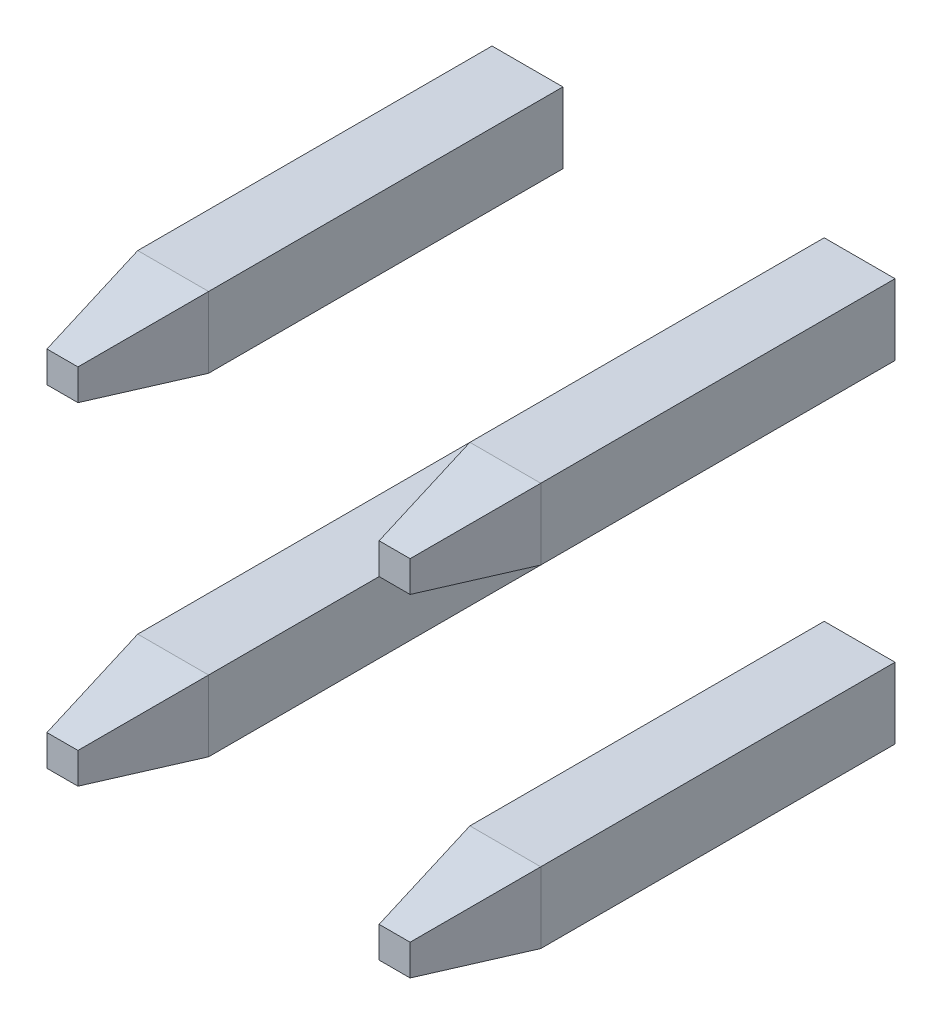
ISO-10303-21;
HEADER;
FILE_DESCRIPTION(('STEP AP214'),'2;1');
FILE_NAME('part.step','',(''),(''),'','','');
FILE_SCHEMA(('AUTOMOTIVE_DESIGN { 1 0 10303 214 1 1 1 1 }'));
ENDSEC;
DATA;
#1=APPLICATION_CONTEXT('core data for automotive mechanical design processes');
#2=APPLICATION_PROTOCOL_DEFINITION('international standard','automotive_design',2000,#1);
#3=PRODUCT_CONTEXT('',#1,'mechanical');
#4=PRODUCT('Part','Part','',(#3));
#5=PRODUCT_RELATED_PRODUCT_CATEGORY('part','',(#4));
#6=PRODUCT_DEFINITION_FORMATION('','',#4);
#7=PRODUCT_DEFINITION_CONTEXT('part definition',#1,'design');
#8=PRODUCT_DEFINITION('design','',#6,#7);
#9=PRODUCT_DEFINITION_SHAPE('','',#8);
#10=(LENGTH_UNIT() NAMED_UNIT(*) SI_UNIT(.MILLI.,.METRE.));
#11=(NAMED_UNIT(*) PLANE_ANGLE_UNIT() SI_UNIT($,.RADIAN.));
#12=(NAMED_UNIT(*) SI_UNIT($,.STERADIAN.) SOLID_ANGLE_UNIT());
#13=UNCERTAINTY_MEASURE_WITH_UNIT(LENGTH_MEASURE(1.E-05),#10,'distance_accuracy_value','');
#14=(GEOMETRIC_REPRESENTATION_CONTEXT(3) GLOBAL_UNCERTAINTY_ASSIGNED_CONTEXT((#13)) GLOBAL_UNIT_ASSIGNED_CONTEXT((#10,
#11,#12)) REPRESENTATION_CONTEXT('',''));
#15=CARTESIAN_POINT('',(0.,0.,0.));
#16=DIRECTION('',(0.,0.,1.));
#17=DIRECTION('',(1.,0.,0.));
#18=AXIS2_PLACEMENT_3D('',#15,#16,#17);
#19=CARTESIAN_POINT('',(-1.27,1.5,2.055));
#20=DIRECTION('',(0.984183323973751,0.,0.177152998314955));
#21=DIRECTION('',(0.,-1.,0.));
#22=AXIS2_PLACEMENT_3D('',#19,#20,#21);
#23=PLANE('',#22);
#24=DIRECTION('',(0.,-1.,0.));
#25=VECTOR('',#24,1.);
#26=CARTESIAN_POINT('',(-1.36,1.64,2.555));
#27=LINE('',#26,#25);
#28=CARTESIAN_POINT('',(-1.36,1.64,2.555));
#29=VERTEX_POINT('',#28);
#30=CARTESIAN_POINT('',(-1.36,1.36,2.555));
#31=VERTEX_POINT('',#30);
#32=EDGE_CURVE('P0_E65',#29,#31,#27,.T.);
#33=ORIENTED_EDGE('',*,*,#32,.T.);
#34=DIRECTION('',(-0.174436949744993,0.174436949744993,0.969094165252957));
#35=VECTOR('',#34,1.);
#36=CARTESIAN_POINT('',(-1.18,1.18,1.555));
#37=LINE('',#36,#35);
#38=CARTESIAN_POINT('',(-1.18,1.18,1.555));
#39=VERTEX_POINT('',#38);
#40=EDGE_CURVE('P0_E68',#39,#31,#37,.T.);
#41=ORIENTED_EDGE('',*,*,#40,.F.);
#42=DIRECTION('',(0.,-1.,0.));
#43=VECTOR('',#42,1.);
#44=CARTESIAN_POINT('',(-1.18,1.82,1.555));
#45=LINE('',#44,#43);
#46=CARTESIAN_POINT('',(-1.18,1.82,1.555));
#47=VERTEX_POINT('',#46);
#48=EDGE_CURVE('P0_E141',#47,#39,#45,.T.);
#49=ORIENTED_EDGE('',*,*,#48,.F.);
#50=DIRECTION('',(0.174436949744993,0.174436949744993,-0.969094165252957));
#51=VECTOR('',#50,1.);
#52=CARTESIAN_POINT('',(-1.36,1.64,2.555));
#53=LINE('',#52,#51);
#54=EDGE_CURVE('P0_E11',#29,#47,#53,.T.);
#55=ORIENTED_EDGE('',*,*,#54,.F.);
#56=EDGE_LOOP('',(#33,#41,#49,#55));
#57=FACE_BOUND('',#56,.T.);
#58=ADVANCED_FACE('P0_F17',(#57),#23,.T.);
#59=CARTESIAN_POINT('',(-1.5,1.73,2.055));
#60=DIRECTION('',(0.,0.984183323973751,0.177152998314955));
#61=DIRECTION('',(1.,0.,0.));
#62=AXIS2_PLACEMENT_3D('',#59,#60,#61);
#63=PLANE('',#62);
#64=DIRECTION('',(-1.,0.,0.));
#65=VECTOR('',#64,1.);
#66=CARTESIAN_POINT('',(-1.18,1.82,1.555));
#67=LINE('',#66,#65);
#68=CARTESIAN_POINT('',(-1.82,1.82,1.555));
#69=VERTEX_POINT('',#68);
#70=EDGE_CURVE('P0_E114',#47,#69,#67,.T.);
#71=ORIENTED_EDGE('',*,*,#70,.T.);
#72=DIRECTION('',(-0.174436949744993,0.174436949744993,-0.969094165252957));
#73=VECTOR('',#72,1.);
#74=CARTESIAN_POINT('',(-1.64,1.64,2.555));
#75=LINE('',#74,#73);
#76=CARTESIAN_POINT('',(-1.64,1.64,2.555));
#77=VERTEX_POINT('',#76);
#78=EDGE_CURVE('P0_E27',#77,#69,#75,.T.);
#79=ORIENTED_EDGE('',*,*,#78,.F.);
#80=DIRECTION('',(-1.,0.,0.));
#81=VECTOR('',#80,1.);
#82=CARTESIAN_POINT('',(-1.36,1.64,2.555));
#83=LINE('',#82,#81);
#84=EDGE_CURVE('P0_E74',#29,#77,#83,.T.);
#85=ORIENTED_EDGE('',*,*,#84,.F.);
#86=ORIENTED_EDGE('',*,*,#54,.T.);
#87=EDGE_LOOP('',(#71,#79,#85,#86));
#88=FACE_BOUND('',#87,.T.);
#89=ADVANCED_FACE('P0_F187',(#88),#63,.T.);
#90=CARTESIAN_POINT('',(-1.73,1.5,2.055));
#91=DIRECTION('',(-0.984183323973751,0.,0.177152998314955));
#92=DIRECTION('',(0.,1.,0.));
#93=AXIS2_PLACEMENT_3D('',#90,#91,#92);
#94=PLANE('',#93);
#95=DIRECTION('',(0.,1.,0.));
#96=VECTOR('',#95,1.);
#97=CARTESIAN_POINT('',(-1.82,1.18,1.555));
#98=LINE('',#97,#96);
#99=CARTESIAN_POINT('',(-1.82,1.18,1.555));
#100=VERTEX_POINT('',#99);
#101=EDGE_CURVE('P0_E99',#100,#69,#98,.T.);
#102=ORIENTED_EDGE('',*,*,#101,.F.);
#103=DIRECTION('',(-0.174436949744993,-0.174436949744993,-0.969094165252957));
#104=VECTOR('',#103,1.);
#105=CARTESIAN_POINT('',(-1.64,1.36,2.555));
#106=LINE('',#105,#104);
#107=CARTESIAN_POINT('',(-1.64,1.36,2.555));
#108=VERTEX_POINT('',#107);
#109=EDGE_CURVE('P0_E84',#108,#100,#106,.T.);
#110=ORIENTED_EDGE('',*,*,#109,.F.);
#111=DIRECTION('',(0.,1.,0.));
#112=VECTOR('',#111,1.);
#113=CARTESIAN_POINT('',(-1.64,1.36,2.555));
#114=LINE('',#113,#112);
#115=EDGE_CURVE('P0_E86',#108,#77,#114,.T.);
#116=ORIENTED_EDGE('',*,*,#115,.T.);
#117=ORIENTED_EDGE('',*,*,#78,.T.);
#118=EDGE_LOOP('',(#102,#110,#116,#117));
#119=FACE_BOUND('',#118,.T.);
#120=ADVANCED_FACE('P0_F192',(#119),#94,.T.);
#121=CARTESIAN_POINT('',(-1.18,1.82,2.555));
#122=DIRECTION('',(0.,0.,1.));
#123=DIRECTION('',(1.,0.,0.));
#124=AXIS2_PLACEMENT_3D('',#121,#122,#123);
#125=PLANE('',#124);
#126=DIRECTION('',(-1.,0.,0.));
#127=VECTOR('',#126,1.);
#128=CARTESIAN_POINT('',(-1.36,1.36,2.555));
#129=LINE('',#128,#127);
#130=EDGE_CURVE('P0_E79',#31,#108,#129,.T.);
#131=ORIENTED_EDGE('',*,*,#130,.F.);
#132=ORIENTED_EDGE('',*,*,#32,.F.);
#133=ORIENTED_EDGE('',*,*,#84,.T.);
#134=ORIENTED_EDGE('',*,*,#115,.F.);
#135=EDGE_LOOP('',(#131,#132,#133,#134));
#136=FACE_BOUND('',#135,.T.);
#137=ADVANCED_FACE('P0_F19',(#136),#125,.T.);
#138=CARTESIAN_POINT('',(-1.5,1.27,2.055));
#139=DIRECTION('',(0.,-0.984183323973751,0.177152998314955));
#140=DIRECTION('',(-1.,0.,0.));
#141=AXIS2_PLACEMENT_3D('',#138,#139,#140);
#142=PLANE('',#141);
#143=ORIENTED_EDGE('',*,*,#130,.T.);
#144=ORIENTED_EDGE('',*,*,#109,.T.);
#145=DIRECTION('',(-1.,0.,0.));
#146=VECTOR('',#145,1.);
#147=CARTESIAN_POINT('',(-1.18,1.18,1.555));
#148=LINE('',#147,#146);
#149=EDGE_CURVE('P0_E81',#39,#100,#148,.T.);
#150=ORIENTED_EDGE('',*,*,#149,.F.);
#151=ORIENTED_EDGE('',*,*,#40,.T.);
#152=EDGE_LOOP('',(#143,#144,#150,#151));
#153=FACE_BOUND('',#152,.T.);
#154=ADVANCED_FACE('P0_F78',(#153),#142,.T.);
#155=CARTESIAN_POINT('',(-1.18,1.18,2.555));
#156=DIRECTION('',(0.,-1.,0.));
#157=DIRECTION('',(0.,0.,-1.));
#158=AXIS2_PLACEMENT_3D('',#155,#156,#157);
#159=PLANE('',#158);
#160=ORIENTED_EDGE('',*,*,#149,.T.);
#161=DIRECTION('',(0.,0.,-1.));
#162=VECTOR('',#161,1.);
#163=CARTESIAN_POINT('',(-1.82,1.18,1.555));
#164=LINE('',#163,#162);
#165=CARTESIAN_POINT('',(-1.82,1.18,-1.645));
#166=VERTEX_POINT('',#165);
#167=EDGE_CURVE('P0_E96',#100,#166,#164,.T.);
#168=ORIENTED_EDGE('',*,*,#167,.T.);
#169=DIRECTION('',(1.,0.,0.));
#170=VECTOR('',#169,1.);
#171=CARTESIAN_POINT('',(-1.82,1.18,-1.645));
#172=LINE('',#171,#170);
#173=CARTESIAN_POINT('',(-1.18,1.18,-1.645));
#174=VERTEX_POINT('',#173);
#175=EDGE_CURVE('P0_E157',#166,#174,#172,.T.);
#176=ORIENTED_EDGE('',*,*,#175,.T.);
#177=DIRECTION('',(0.,0.,-1.));
#178=VECTOR('',#177,1.);
#179=CARTESIAN_POINT('',(-1.18,1.18,1.555));
#180=LINE('',#179,#178);
#181=EDGE_CURVE('P0_E131',#39,#174,#180,.T.);
#182=ORIENTED_EDGE('',*,*,#181,.F.);
#183=EDGE_LOOP('',(#160,#168,#176,#182));
#184=FACE_BOUND('',#183,.T.);
#185=ADVANCED_FACE('P0_F193',(#184),#159,.T.);
#186=CARTESIAN_POINT('',(-1.82,0.,0.));
#187=DIRECTION('',(1.,0.,0.));
#188=DIRECTION('',(0.,1.,0.));
#189=AXIS2_PLACEMENT_3D('',#186,#187,#188);
#190=PLANE('',#189);
#191=ORIENTED_EDGE('',*,*,#101,.T.);
#192=DIRECTION('',(0.,0.,1.));
#193=VECTOR('',#192,1.);
#194=CARTESIAN_POINT('',(-1.82,1.82,-1.645));
#195=LINE('',#194,#193);
#196=CARTESIAN_POINT('',(-1.82,1.82,-1.645));
#197=VERTEX_POINT('',#196);
#198=EDGE_CURVE('P0_E115',#197,#69,#195,.T.);
#199=ORIENTED_EDGE('',*,*,#198,.F.);
#200=DIRECTION('',(0.,1.,0.));
#201=VECTOR('',#200,1.);
#202=CARTESIAN_POINT('',(-1.82,1.18,-1.645));
#203=LINE('',#202,#201);
#204=EDGE_CURVE('P0_E150',#166,#197,#203,.T.);
#205=ORIENTED_EDGE('',*,*,#204,.F.);
#206=ORIENTED_EDGE('',*,*,#167,.F.);
#207=EDGE_LOOP('',(#191,#199,#205,#206));
#208=FACE_BOUND('',#207,.T.);
#209=ADVANCED_FACE('P0_F190',(#208),#190,.F.);
#210=CARTESIAN_POINT('',(-1.18,1.82,-6.905));
#211=DIRECTION('',(0.,1.,0.));
#212=DIRECTION('',(1.,0.,0.));
#213=AXIS2_PLACEMENT_3D('',#210,#211,#212);
#214=PLANE('',#213);
#215=ORIENTED_EDGE('',*,*,#70,.F.);
#216=DIRECTION('',(0.,0.,1.));
#217=VECTOR('',#216,1.);
#218=CARTESIAN_POINT('',(-1.18,1.82,-1.645));
#219=LINE('',#218,#217);
#220=CARTESIAN_POINT('',(-1.18,1.82,-1.645));
#221=VERTEX_POINT('',#220);
#222=EDGE_CURVE('P0_E126',#221,#47,#219,.T.);
#223=ORIENTED_EDGE('',*,*,#222,.F.);
#224=DIRECTION('',(1.,0.,0.));
#225=VECTOR('',#224,1.);
#226=CARTESIAN_POINT('',(-1.82,1.82,-1.645));
#227=LINE('',#226,#225);
#228=EDGE_CURVE('P0_E145',#197,#221,#227,.T.);
#229=ORIENTED_EDGE('',*,*,#228,.F.);
#230=ORIENTED_EDGE('',*,*,#198,.T.);
#231=EDGE_LOOP('',(#215,#223,#229,#230));
#232=FACE_BOUND('',#231,.T.);
#233=ADVANCED_FACE('P0_F188',(#232),#214,.T.);
#234=CARTESIAN_POINT('',(-1.18,0.,0.));
#235=DIRECTION('',(1.,0.,0.));
#236=DIRECTION('',(0.,1.,0.));
#237=AXIS2_PLACEMENT_3D('',#234,#235,#236);
#238=PLANE('',#237);
#239=ORIENTED_EDGE('',*,*,#48,.T.);
#240=ORIENTED_EDGE('',*,*,#181,.T.);
#241=DIRECTION('',(0.,1.,0.));
#242=VECTOR('',#241,1.);
#243=CARTESIAN_POINT('',(-1.18,1.18,-1.645));
#244=LINE('',#243,#242);
#245=EDGE_CURVE('P0_E161',#174,#221,#244,.T.);
#246=ORIENTED_EDGE('',*,*,#245,.T.);
#247=ORIENTED_EDGE('',*,*,#222,.T.);
#248=EDGE_LOOP('',(#239,#240,#246,#247));
#249=FACE_BOUND('',#248,.T.);
#250=ADVANCED_FACE('P0_F167',(#249),#238,.T.);
#251=CARTESIAN_POINT('',(-1.619335750828,1.563108766945,-1.645));
#252=DIRECTION('',(0.,0.,1.));
#253=DIRECTION('',(1.,0.,0.));
#254=AXIS2_PLACEMENT_3D('',#251,#252,#253);
#255=PLANE('',#254);
#256=ORIENTED_EDGE('',*,*,#245,.F.);
#257=ORIENTED_EDGE('',*,*,#175,.F.);
#258=ORIENTED_EDGE('',*,*,#204,.T.);
#259=ORIENTED_EDGE('',*,*,#228,.T.);
#260=EDGE_LOOP('',(#256,#257,#258,#259));
#261=FACE_BOUND('',#260,.T.);
#262=ADVANCED_FACE('P0_F174',(#261),#255,.F.);
#263=CLOSED_SHELL('',(#58,#89,#120,#137,#154,#185,#209,#233,#250,#262));
#264=MANIFOLD_SOLID_BREP('P0_B1',#263);
#265=CARTESIAN_POINT('',(1.428164169133,1.473145672445,-1.645));
#266=DIRECTION('',(0.,0.,1.));
#267=DIRECTION('',(1.,0.,0.));
#268=AXIS2_PLACEMENT_3D('',#265,#266,#267);
#269=PLANE('',#268);
#270=DIRECTION('',(0.,1.,0.));
#271=VECTOR('',#270,1.);
#272=CARTESIAN_POINT('',(1.82,1.18,-1.645));
#273=LINE('',#272,#271);
#274=CARTESIAN_POINT('',(1.82,1.18,-1.645));
#275=VERTEX_POINT('',#274);
#276=CARTESIAN_POINT('',(1.82,1.82,-1.645));
#277=VERTEX_POINT('',#276);
#278=EDGE_CURVE('P1_E11',#275,#277,#273,.T.);
#279=ORIENTED_EDGE('',*,*,#278,.F.);
#280=DIRECTION('',(1.,0.,0.));
#281=VECTOR('',#280,1.);
#282=CARTESIAN_POINT('',(1.18,1.18,-1.645));
#283=LINE('',#282,#281);
#284=CARTESIAN_POINT('',(1.18,1.18,-1.645));
#285=VERTEX_POINT('',#284);
#286=EDGE_CURVE('P1_E71',#285,#275,#283,.T.);
#287=ORIENTED_EDGE('',*,*,#286,.F.);
#288=DIRECTION('',(0.,1.,0.));
#289=VECTOR('',#288,1.);
#290=CARTESIAN_POINT('',(1.18,1.18,-1.645));
#291=LINE('',#290,#289);
#292=CARTESIAN_POINT('',(1.18,1.82,-1.645));
#293=VERTEX_POINT('',#292);
#294=EDGE_CURVE('P1_E74',#285,#293,#291,.T.);
#295=ORIENTED_EDGE('',*,*,#294,.T.);
#296=DIRECTION('',(1.,0.,0.));
#297=VECTOR('',#296,1.);
#298=CARTESIAN_POINT('',(1.18,1.82,-1.645));
#299=LINE('',#298,#297);
#300=EDGE_CURVE('P1_E27',#293,#277,#299,.T.);
#301=ORIENTED_EDGE('',*,*,#300,.T.);
#302=EDGE_LOOP('',(#279,#287,#295,#301));
#303=FACE_BOUND('',#302,.T.);
#304=ADVANCED_FACE('P1_F17',(#303),#269,.F.);
#305=CARTESIAN_POINT('',(1.82,0.,0.));
#306=DIRECTION('',(1.,0.,0.));
#307=DIRECTION('',(0.,1.,0.));
#308=AXIS2_PLACEMENT_3D('',#305,#306,#307);
#309=PLANE('',#308);
#310=DIRECTION('',(0.,-1.,0.));
#311=VECTOR('',#310,1.);
#312=CARTESIAN_POINT('',(1.82,1.82,1.555));
#313=LINE('',#312,#311);
#314=CARTESIAN_POINT('',(1.82,1.82,1.555));
#315=VERTEX_POINT('',#314);
#316=CARTESIAN_POINT('',(1.82,1.18,1.555));
#317=VERTEX_POINT('',#316);
#318=EDGE_CURVE('P1_E110',#315,#317,#313,.T.);
#319=ORIENTED_EDGE('',*,*,#318,.T.);
#320=DIRECTION('',(0.,0.,-1.));
#321=VECTOR('',#320,1.);
#322=CARTESIAN_POINT('',(1.82,1.18,1.555));
#323=LINE('',#322,#321);
#324=EDGE_CURVE('P1_E78',#317,#275,#323,.T.);
#325=ORIENTED_EDGE('',*,*,#324,.T.);
#326=ORIENTED_EDGE('',*,*,#278,.T.);
#327=DIRECTION('',(0.,0.,1.));
#328=VECTOR('',#327,1.);
#329=CARTESIAN_POINT('',(1.82,1.82,-1.645));
#330=LINE('',#329,#328);
#331=EDGE_CURVE('P1_E20',#277,#315,#330,.T.);
#332=ORIENTED_EDGE('',*,*,#331,.T.);
#333=EDGE_LOOP('',(#319,#325,#326,#332));
#334=FACE_BOUND('',#333,.T.);
#335=ADVANCED_FACE('P1_F172',(#334),#309,.T.);
#336=CARTESIAN_POINT('',(1.82,1.82,-6.905));
#337=DIRECTION('',(0.,1.,0.));
#338=DIRECTION('',(1.,0.,0.));
#339=AXIS2_PLACEMENT_3D('',#336,#337,#338);
#340=PLANE('',#339);
#341=DIRECTION('',(-1.,0.,0.));
#342=VECTOR('',#341,1.);
#343=CARTESIAN_POINT('',(1.82,1.82,1.555));
#344=LINE('',#343,#342);
#345=CARTESIAN_POINT('',(1.18,1.82,1.555));
#346=VERTEX_POINT('',#345);
#347=EDGE_CURVE('P1_E109',#315,#346,#344,.T.);
#348=ORIENTED_EDGE('',*,*,#347,.F.);
#349=ORIENTED_EDGE('',*,*,#331,.F.);
#350=ORIENTED_EDGE('',*,*,#300,.F.);
#351=DIRECTION('',(0.,0.,1.));
#352=VECTOR('',#351,1.);
#353=CARTESIAN_POINT('',(1.18,1.82,-1.645));
#354=LINE('',#353,#352);
#355=EDGE_CURVE('P1_E93',#293,#346,#354,.T.);
#356=ORIENTED_EDGE('',*,*,#355,.T.);
#357=EDGE_LOOP('',(#348,#349,#350,#356));
#358=FACE_BOUND('',#357,.T.);
#359=ADVANCED_FACE('P1_F176',(#358),#340,.T.);
#360=CARTESIAN_POINT('',(1.82,1.18,2.555));
#361=DIRECTION('',(0.,-1.,0.));
#362=DIRECTION('',(0.,0.,-1.));
#363=AXIS2_PLACEMENT_3D('',#360,#361,#362);
#364=PLANE('',#363);
#365=DIRECTION('',(-1.,0.,0.));
#366=VECTOR('',#365,1.);
#367=CARTESIAN_POINT('',(1.82,1.18,1.555));
#368=LINE('',#367,#366);
#369=CARTESIAN_POINT('',(1.18,1.18,1.555));
#370=VERTEX_POINT('',#369);
#371=EDGE_CURVE('P1_E84',#317,#370,#368,.T.);
#372=ORIENTED_EDGE('',*,*,#371,.T.);
#373=DIRECTION('',(0.,0.,-1.));
#374=VECTOR('',#373,1.);
#375=CARTESIAN_POINT('',(1.18,1.18,1.555));
#376=LINE('',#375,#374);
#377=EDGE_CURVE('P1_E79',#370,#285,#376,.T.);
#378=ORIENTED_EDGE('',*,*,#377,.T.);
#379=ORIENTED_EDGE('',*,*,#286,.T.);
#380=ORIENTED_EDGE('',*,*,#324,.F.);
#381=EDGE_LOOP('',(#372,#378,#379,#380));
#382=FACE_BOUND('',#381,.T.);
#383=ADVANCED_FACE('P1_F82',(#382),#364,.T.);
#384=CARTESIAN_POINT('',(1.18,0.,0.));
#385=DIRECTION('',(1.,0.,0.));
#386=DIRECTION('',(0.,1.,0.));
#387=AXIS2_PLACEMENT_3D('',#384,#385,#386);
#388=PLANE('',#387);
#389=DIRECTION('',(0.,1.,0.));
#390=VECTOR('',#389,1.);
#391=CARTESIAN_POINT('',(1.18,1.18,1.555));
#392=LINE('',#391,#390);
#393=EDGE_CURVE('P1_E100',#370,#346,#392,.T.);
#394=ORIENTED_EDGE('',*,*,#393,.T.);
#395=ORIENTED_EDGE('',*,*,#355,.F.);
#396=ORIENTED_EDGE('',*,*,#294,.F.);
#397=ORIENTED_EDGE('',*,*,#377,.F.);
#398=EDGE_LOOP('',(#394,#395,#396,#397));
#399=FACE_BOUND('',#398,.T.);
#400=ADVANCED_FACE('P1_F91',(#399),#388,.F.);
#401=CARTESIAN_POINT('',(1.27,1.5,2.055));
#402=DIRECTION('',(-0.984183323973751,0.,0.177152998314955));
#403=DIRECTION('',(0.,1.,0.));
#404=AXIS2_PLACEMENT_3D('',#401,#402,#403);
#405=PLANE('',#404);
#406=ORIENTED_EDGE('',*,*,#393,.F.);
#407=DIRECTION('',(-0.174436949744993,-0.174436949744993,-0.969094165252957));
#408=VECTOR('',#407,1.);
#409=CARTESIAN_POINT('',(1.36,1.36,2.555));
#410=LINE('',#409,#408);
#411=CARTESIAN_POINT('',(1.36,1.36,2.555));
#412=VERTEX_POINT('',#411);
#413=EDGE_CURVE('P1_E135',#412,#370,#410,.T.);
#414=ORIENTED_EDGE('',*,*,#413,.F.);
#415=DIRECTION('',(0.,1.,0.));
#416=VECTOR('',#415,1.);
#417=CARTESIAN_POINT('',(1.36,1.36,2.555));
#418=LINE('',#417,#416);
#419=CARTESIAN_POINT('',(1.36,1.64,2.555));
#420=VERTEX_POINT('',#419);
#421=EDGE_CURVE('P1_E111',#412,#420,#418,.T.);
#422=ORIENTED_EDGE('',*,*,#421,.T.);
#423=DIRECTION('',(-0.174436949744993,0.174436949744993,-0.969094165252957));
#424=VECTOR('',#423,1.);
#425=CARTESIAN_POINT('',(1.36,1.64,2.555));
#426=LINE('',#425,#424);
#427=EDGE_CURVE('P1_E127',#420,#346,#426,.T.);
#428=ORIENTED_EDGE('',*,*,#427,.T.);
#429=EDGE_LOOP('',(#406,#414,#422,#428));
#430=FACE_BOUND('',#429,.T.);
#431=ADVANCED_FACE('P1_F189',(#430),#405,.T.);
#432=CARTESIAN_POINT('',(1.5,1.73,2.055));
#433=DIRECTION('',(0.,0.984183323973751,0.177152998314955));
#434=DIRECTION('',(1.,0.,0.));
#435=AXIS2_PLACEMENT_3D('',#432,#433,#434);
#436=PLANE('',#435);
#437=ORIENTED_EDGE('',*,*,#347,.T.);
#438=ORIENTED_EDGE('',*,*,#427,.F.);
#439=DIRECTION('',(-1.,0.,0.));
#440=VECTOR('',#439,1.);
#441=CARTESIAN_POINT('',(1.64,1.64,2.555));
#442=LINE('',#441,#440);
#443=CARTESIAN_POINT('',(1.64,1.64,2.555));
#444=VERTEX_POINT('',#443);
#445=EDGE_CURVE('P1_E115',#444,#420,#442,.T.);
#446=ORIENTED_EDGE('',*,*,#445,.F.);
#447=DIRECTION('',(0.174436949744993,0.174436949744993,-0.969094165252957));
#448=VECTOR('',#447,1.);
#449=CARTESIAN_POINT('',(1.64,1.64,2.555));
#450=LINE('',#449,#448);
#451=EDGE_CURVE('P1_E105',#444,#315,#450,.T.);
#452=ORIENTED_EDGE('',*,*,#451,.T.);
#453=EDGE_LOOP('',(#437,#438,#446,#452));
#454=FACE_BOUND('',#453,.T.);
#455=ADVANCED_FACE('P1_F179',(#454),#436,.T.);
#456=CARTESIAN_POINT('',(1.73,1.5,2.055));
#457=DIRECTION('',(0.984183323973751,0.,0.177152998314955));
#458=DIRECTION('',(0.,-1.,0.));
#459=AXIS2_PLACEMENT_3D('',#456,#457,#458);
#460=PLANE('',#459);
#461=DIRECTION('',(0.,-1.,0.));
#462=VECTOR('',#461,1.);
#463=CARTESIAN_POINT('',(1.64,1.64,2.555));
#464=LINE('',#463,#462);
#465=CARTESIAN_POINT('',(1.64,1.36,2.555));
#466=VERTEX_POINT('',#465);
#467=EDGE_CURVE('P1_E116',#444,#466,#464,.T.);
#468=ORIENTED_EDGE('',*,*,#467,.T.);
#469=DIRECTION('',(-0.174436949744993,0.174436949744993,0.969094165252957));
#470=VECTOR('',#469,1.);
#471=CARTESIAN_POINT('',(1.82,1.18,1.555));
#472=LINE('',#471,#470);
#473=EDGE_CURVE('P1_E120',#317,#466,#472,.T.);
#474=ORIENTED_EDGE('',*,*,#473,.F.);
#475=ORIENTED_EDGE('',*,*,#318,.F.);
#476=ORIENTED_EDGE('',*,*,#451,.F.);
#477=EDGE_LOOP('',(#468,#474,#475,#476));
#478=FACE_BOUND('',#477,.T.);
#479=ADVANCED_FACE('P1_F180',(#478),#460,.T.);
#480=CARTESIAN_POINT('',(1.82,1.82,2.555));
#481=DIRECTION('',(0.,0.,1.));
#482=DIRECTION('',(1.,0.,0.));
#483=AXIS2_PLACEMENT_3D('',#480,#481,#482);
#484=PLANE('',#483);
#485=DIRECTION('',(-1.,0.,0.));
#486=VECTOR('',#485,1.);
#487=CARTESIAN_POINT('',(1.64,1.36,2.555));
#488=LINE('',#487,#486);
#489=EDGE_CURVE('P1_E144',#466,#412,#488,.T.);
#490=ORIENTED_EDGE('',*,*,#489,.F.);
#491=ORIENTED_EDGE('',*,*,#467,.F.);
#492=ORIENTED_EDGE('',*,*,#445,.T.);
#493=ORIENTED_EDGE('',*,*,#421,.F.);
#494=EDGE_LOOP('',(#490,#491,#492,#493));
#495=FACE_BOUND('',#494,.T.);
#496=ADVANCED_FACE('P1_F160',(#495),#484,.T.);
#497=CARTESIAN_POINT('',(1.5,1.27,2.055));
#498=DIRECTION('',(0.,-0.984183323973751,0.177152998314955));
#499=DIRECTION('',(-1.,0.,0.));
#500=AXIS2_PLACEMENT_3D('',#497,#498,#499);
#501=PLANE('',#500);
#502=ORIENTED_EDGE('',*,*,#489,.T.);
#503=ORIENTED_EDGE('',*,*,#413,.T.);
#504=ORIENTED_EDGE('',*,*,#371,.F.);
#505=ORIENTED_EDGE('',*,*,#473,.T.);
#506=EDGE_LOOP('',(#502,#503,#504,#505));
#507=FACE_BOUND('',#506,.T.);
#508=ADVANCED_FACE('P1_F153',(#507),#501,.T.);
#509=CLOSED_SHELL('',(#304,#335,#359,#383,#400,#431,#455,#479,#496,#508));
#510=MANIFOLD_SOLID_BREP('P1_B1',#509);
#511=CARTESIAN_POINT('',(-1.18,-1.82,2.555));
#512=DIRECTION('',(0.,-1.,0.));
#513=DIRECTION('',(0.,0.,-1.));
#514=AXIS2_PLACEMENT_3D('',#511,#512,#513);
#515=PLANE('',#514);
#516=DIRECTION('',(-1.,0.,0.));
#517=VECTOR('',#516,1.);
#518=CARTESIAN_POINT('',(-1.18,-1.82,1.555));
#519=LINE('',#518,#517);
#520=CARTESIAN_POINT('',(-1.18,-1.82,1.555));
#521=VERTEX_POINT('',#520);
#522=CARTESIAN_POINT('',(-1.82,-1.82,1.555));
#523=VERTEX_POINT('',#522);
#524=EDGE_CURVE('P2_E11',#521,#523,#519,.T.);
#525=ORIENTED_EDGE('',*,*,#524,.T.);
#526=DIRECTION('',(0.,0.,-1.));
#527=VECTOR('',#526,1.);
#528=CARTESIAN_POINT('',(-1.82,-1.82,1.555));
#529=LINE('',#528,#527);
#530=CARTESIAN_POINT('',(-1.82,-1.82,-1.645));
#531=VERTEX_POINT('',#530);
#532=EDGE_CURVE('P2_E113',#523,#531,#529,.T.);
#533=ORIENTED_EDGE('',*,*,#532,.T.);
#534=DIRECTION('',(1.,0.,0.));
#535=VECTOR('',#534,1.);
#536=CARTESIAN_POINT('',(-1.82,-1.82,-1.645));
#537=LINE('',#536,#535);
#538=CARTESIAN_POINT('',(-1.18,-1.82,-1.645));
#539=VERTEX_POINT('',#538);
#540=EDGE_CURVE('P2_E111',#531,#539,#537,.T.);
#541=ORIENTED_EDGE('',*,*,#540,.T.);
#542=DIRECTION('',(0.,0.,-1.));
#543=VECTOR('',#542,1.);
#544=CARTESIAN_POINT('',(-1.18,-1.82,1.555));
#545=LINE('',#544,#543);
#546=EDGE_CURVE('P2_E98',#521,#539,#545,.T.);
#547=ORIENTED_EDGE('',*,*,#546,.F.);
#548=EDGE_LOOP('',(#525,#533,#541,#547));
#549=FACE_BOUND('',#548,.T.);
#550=ADVANCED_FACE('P2_F17',(#549),#515,.T.);
#551=CARTESIAN_POINT('',(-1.5,-1.73,2.055));
#552=DIRECTION('',(0.,-0.984183323973751,0.177152998314955));
#553=DIRECTION('',(-1.,0.,0.));
#554=AXIS2_PLACEMENT_3D('',#551,#552,#553);
#555=PLANE('',#554);
#556=DIRECTION('',(-1.,0.,0.));
#557=VECTOR('',#556,1.);
#558=CARTESIAN_POINT('',(-1.36,-1.64,2.555));
#559=LINE('',#558,#557);
#560=CARTESIAN_POINT('',(-1.36,-1.64,2.555));
#561=VERTEX_POINT('',#560);
#562=CARTESIAN_POINT('',(-1.64,-1.64,2.555));
#563=VERTEX_POINT('',#562);
#564=EDGE_CURVE('P2_E25',#561,#563,#559,.T.);
#565=ORIENTED_EDGE('',*,*,#564,.T.);
#566=DIRECTION('',(-0.174436949744993,-0.174436949744993,-0.969094165252957));
#567=VECTOR('',#566,1.);
#568=CARTESIAN_POINT('',(-1.64,-1.64,2.555));
#569=LINE('',#568,#567);
#570=EDGE_CURVE('P2_E148',#563,#523,#569,.T.);
#571=ORIENTED_EDGE('',*,*,#570,.T.);
#572=ORIENTED_EDGE('',*,*,#524,.F.);
#573=DIRECTION('',(-0.174436949744993,0.174436949744993,0.969094165252957));
#574=VECTOR('',#573,1.);
#575=CARTESIAN_POINT('',(-1.18,-1.82,1.555));
#576=LINE('',#575,#574);
#577=EDGE_CURVE('P2_E164',#521,#561,#576,.T.);
#578=ORIENTED_EDGE('',*,*,#577,.T.);
#579=EDGE_LOOP('',(#565,#571,#572,#578));
#580=FACE_BOUND('',#579,.T.);
#581=ADVANCED_FACE('P2_F239',(#580),#555,.T.);
#582=CARTESIAN_POINT('',(-1.18,-1.18,2.555));
#583=DIRECTION('',(0.,0.,1.));
#584=DIRECTION('',(1.,0.,0.));
#585=AXIS2_PLACEMENT_3D('',#582,#583,#584);
#586=PLANE('',#585);
#587=ORIENTED_EDGE('',*,*,#564,.F.);
#588=DIRECTION('',(0.,-1.,0.));
#589=VECTOR('',#588,1.);
#590=CARTESIAN_POINT('',(-1.36,-1.36,2.555));
#591=LINE('',#590,#589);
#592=CARTESIAN_POINT('',(-1.36,-1.36,2.555));
#593=VERTEX_POINT('',#592);
#594=EDGE_CURVE('P2_E46',#593,#561,#591,.T.);
#595=ORIENTED_EDGE('',*,*,#594,.F.);
#596=DIRECTION('',(-1.,0.,0.));
#597=VECTOR('',#596,1.);
#598=CARTESIAN_POINT('',(-1.36,-1.36,2.555));
#599=LINE('',#598,#597);
#600=CARTESIAN_POINT('',(-1.64,-1.36,2.555));
#601=VERTEX_POINT('',#600);
#602=EDGE_CURVE('P2_E137',#593,#601,#599,.T.);
#603=ORIENTED_EDGE('',*,*,#602,.T.);
#604=DIRECTION('',(0.,1.,0.));
#605=VECTOR('',#604,1.);
#606=CARTESIAN_POINT('',(-1.64,-1.64,2.555));
#607=LINE('',#606,#605);
#608=EDGE_CURVE('P2_E151',#563,#601,#607,.T.);
#609=ORIENTED_EDGE('',*,*,#608,.F.);
#610=EDGE_LOOP('',(#587,#595,#603,#609));
#611=FACE_BOUND('',#610,.T.);
#612=ADVANCED_FACE('P2_F249',(#611),#586,.T.);
#613=CARTESIAN_POINT('',(-1.27,-1.5,2.055));
#614=DIRECTION('',(0.984183323973751,0.,0.177152998314955));
#615=DIRECTION('',(0.,-1.,0.));
#616=AXIS2_PLACEMENT_3D('',#613,#614,#615);
#617=PLANE('',#616);
#618=ORIENTED_EDGE('',*,*,#594,.T.);
#619=ORIENTED_EDGE('',*,*,#577,.F.);
#620=DIRECTION('',(0.,-1.,0.));
#621=VECTOR('',#620,1.);
#622=CARTESIAN_POINT('',(-1.18,-1.18,1.555));
#623=LINE('',#622,#621);
#624=CARTESIAN_POINT('',(-1.18,-1.18,1.555));
#625=VERTEX_POINT('',#624);
#626=EDGE_CURVE('P2_E105',#625,#521,#623,.T.);
#627=ORIENTED_EDGE('',*,*,#626,.F.);
#628=DIRECTION('',(0.174436949744993,0.174436949744993,-0.969094165252957));
#629=VECTOR('',#628,1.);
#630=CARTESIAN_POINT('',(-1.36,-1.36,2.555));
#631=LINE('',#630,#629);
#632=EDGE_CURVE('P2_E152',#593,#625,#631,.T.);
#633=ORIENTED_EDGE('',*,*,#632,.F.);
#634=EDGE_LOOP('',(#618,#619,#627,#633));
#635=FACE_BOUND('',#634,.T.);
#636=ADVANCED_FACE('P2_F243',(#635),#617,.T.);
#637=CARTESIAN_POINT('',(-1.18,-1.18,-4.285));
#638=DIRECTION('',(0.,1.,0.));
#639=DIRECTION('',(1.,0.,0.));
#640=AXIS2_PLACEMENT_3D('',#637,#638,#639);
#641=PLANE('',#640);
#642=DIRECTION('',(-1.,0.,0.));
#643=VECTOR('',#642,1.);
#644=CARTESIAN_POINT('',(-1.18,-1.18,1.555));
#645=LINE('',#644,#643);
#646=CARTESIAN_POINT('',(-1.82,-1.18,1.555));
#647=VERTEX_POINT('',#646);
#648=EDGE_CURVE('P2_E70',#625,#647,#645,.T.);
#649=ORIENTED_EDGE('',*,*,#648,.F.);
#650=DIRECTION('',(0.,0.,1.));
#651=VECTOR('',#650,1.);
#652=CARTESIAN_POINT('',(-1.18,-1.18,-1.645));
#653=LINE('',#652,#651);
#654=CARTESIAN_POINT('',(-1.18,-1.18,-1.645));
#655=VERTEX_POINT('',#654);
#656=EDGE_CURVE('P2_E91',#655,#625,#653,.T.);
#657=ORIENTED_EDGE('',*,*,#656,.F.);
#658=DIRECTION('',(1.,0.,0.));
#659=VECTOR('',#658,1.);
#660=CARTESIAN_POINT('',(-1.82,-1.18,-1.645));
#661=LINE('',#660,#659);
#662=CARTESIAN_POINT('',(-1.82,-1.18,-1.645));
#663=VERTEX_POINT('',#662);
#664=EDGE_CURVE('P2_E120',#663,#655,#661,.T.);
#665=ORIENTED_EDGE('',*,*,#664,.F.);
#666=DIRECTION('',(0.,0.,1.));
#667=VECTOR('',#666,1.);
#668=CARTESIAN_POINT('',(-1.82,-1.18,-1.645));
#669=LINE('',#668,#667);
#670=EDGE_CURVE('P2_E142',#663,#647,#669,.T.);
#671=ORIENTED_EDGE('',*,*,#670,.T.);
#672=EDGE_LOOP('',(#649,#657,#665,#671));
#673=FACE_BOUND('',#672,.T.);
#674=ADVANCED_FACE('P2_F248',(#673),#641,.T.);
#675=CARTESIAN_POINT('',(-1.5,-1.27,2.055));
#676=DIRECTION('',(0.,0.984183323973751,0.177152998314955));
#677=DIRECTION('',(1.,0.,0.));
#678=AXIS2_PLACEMENT_3D('',#675,#676,#677);
#679=PLANE('',#678);
#680=ORIENTED_EDGE('',*,*,#648,.T.);
#681=DIRECTION('',(-0.174436949744993,0.174436949744993,-0.969094165252957));
#682=VECTOR('',#681,1.);
#683=CARTESIAN_POINT('',(-1.64,-1.36,2.555));
#684=LINE('',#683,#682);
#685=EDGE_CURVE('P2_E138',#601,#647,#684,.T.);
#686=ORIENTED_EDGE('',*,*,#685,.F.);
#687=ORIENTED_EDGE('',*,*,#602,.F.);
#688=ORIENTED_EDGE('',*,*,#632,.T.);
#689=EDGE_LOOP('',(#680,#686,#687,#688));
#690=FACE_BOUND('',#689,.T.);
#691=ADVANCED_FACE('P2_F258',(#690),#679,.T.);
#692=CARTESIAN_POINT('',(-1.73,-1.5,2.055));
#693=DIRECTION('',(-0.984183323973751,0.,0.177152998314955));
#694=DIRECTION('',(0.,1.,0.));
#695=AXIS2_PLACEMENT_3D('',#692,#693,#694);
#696=PLANE('',#695);
#697=DIRECTION('',(0.,1.,0.));
#698=VECTOR('',#697,1.);
#699=CARTESIAN_POINT('',(-1.82,-1.82,1.555));
#700=LINE('',#699,#698);
#701=EDGE_CURVE('P2_E134',#523,#647,#700,.T.);
#702=ORIENTED_EDGE('',*,*,#701,.F.);
#703=ORIENTED_EDGE('',*,*,#570,.F.);
#704=ORIENTED_EDGE('',*,*,#608,.T.);
#705=ORIENTED_EDGE('',*,*,#685,.T.);
#706=EDGE_LOOP('',(#702,#703,#704,#705));
#707=FACE_BOUND('',#706,.T.);
#708=ADVANCED_FACE('P2_F266',(#707),#696,.T.);
#709=CARTESIAN_POINT('',(-1.82,0.,0.));
#710=DIRECTION('',(1.,0.,0.));
#711=DIRECTION('',(0.,1.,0.));
#712=AXIS2_PLACEMENT_3D('',#709,#710,#711);
#713=PLANE('',#712);
#714=ORIENTED_EDGE('',*,*,#701,.T.);
#715=ORIENTED_EDGE('',*,*,#670,.F.);
#716=DIRECTION('',(0.,1.,0.));
#717=VECTOR('',#716,1.);
#718=CARTESIAN_POINT('',(-1.82,-1.82,-1.645));
#719=LINE('',#718,#717);
#720=EDGE_CURVE('P2_E127',#531,#663,#719,.T.);
#721=ORIENTED_EDGE('',*,*,#720,.F.);
#722=ORIENTED_EDGE('',*,*,#532,.F.);
#723=EDGE_LOOP('',(#714,#715,#721,#722));
#724=FACE_BOUND('',#723,.T.);
#725=ADVANCED_FACE('P2_F231',(#724),#713,.F.);
#726=CARTESIAN_POINT('',(-1.18,0.,0.));
#727=DIRECTION('',(1.,0.,0.));
#728=DIRECTION('',(0.,1.,0.));
#729=AXIS2_PLACEMENT_3D('',#726,#727,#728);
#730=PLANE('',#729);
#731=ORIENTED_EDGE('',*,*,#626,.T.);
#732=ORIENTED_EDGE('',*,*,#546,.T.);
#733=DIRECTION('',(0.,1.,0.));
#734=VECTOR('',#733,1.);
#735=CARTESIAN_POINT('',(-1.18,-1.82,-1.645));
#736=LINE('',#735,#734);
#737=EDGE_CURVE('P2_E102',#539,#655,#736,.T.);
#738=ORIENTED_EDGE('',*,*,#737,.T.);
#739=ORIENTED_EDGE('',*,*,#656,.T.);
#740=EDGE_LOOP('',(#731,#732,#738,#739));
#741=FACE_BOUND('',#740,.T.);
#742=ADVANCED_FACE('P2_F100',(#741),#730,.T.);
#743=CARTESIAN_POINT('',(-1.428164169133,-1.487984297783,-1.645));
#744=DIRECTION('',(0.,0.,1.));
#745=DIRECTION('',(1.,0.,0.));
#746=AXIS2_PLACEMENT_3D('',#743,#744,#745);
#747=PLANE('',#746);
#748=ORIENTED_EDGE('',*,*,#720,.T.);
#749=ORIENTED_EDGE('',*,*,#664,.T.);
#750=ORIENTED_EDGE('',*,*,#737,.F.);
#751=ORIENTED_EDGE('',*,*,#540,.F.);
#752=EDGE_LOOP('',(#748,#749,#750,#751));
#753=FACE_BOUND('',#752,.T.);
#754=ADVANCED_FACE('P2_F119',(#753),#747,.F.);
#755=CLOSED_SHELL('',(#550,#581,#612,#636,#674,#691,#708,#725,#742,#754));
#756=MANIFOLD_SOLID_BREP('P2_B1',#755);
#757=CARTESIAN_POINT('',(1.551863427877,-1.555456618658,-1.645));
#758=DIRECTION('',(0.,0.,1.));
#759=DIRECTION('',(1.,0.,0.));
#760=AXIS2_PLACEMENT_3D('',#757,#758,#759);
#761=PLANE('',#760);
#762=DIRECTION('',(0.,1.,0.));
#763=VECTOR('',#762,1.);
#764=CARTESIAN_POINT('',(1.18,-1.82,-1.645));
#765=LINE('',#764,#763);
#766=CARTESIAN_POINT('',(1.18,-1.82,-1.645));
#767=VERTEX_POINT('',#766);
#768=CARTESIAN_POINT('',(1.18,-1.18,-1.645));
#769=VERTEX_POINT('',#768);
#770=EDGE_CURVE('P3_E27',#767,#769,#765,.T.);
#771=ORIENTED_EDGE('',*,*,#770,.T.);
#772=DIRECTION('',(1.,0.,0.));
#773=VECTOR('',#772,1.);
#774=CARTESIAN_POINT('',(1.18,-1.18,-1.645));
#775=LINE('',#774,#773);
#776=CARTESIAN_POINT('',(1.82,-1.18,-1.645));
#777=VERTEX_POINT('',#776);
#778=EDGE_CURVE('P3_E69',#769,#777,#775,.T.);
#779=ORIENTED_EDGE('',*,*,#778,.T.);
#780=DIRECTION('',(0.,1.,0.));
#781=VECTOR('',#780,1.);
#782=CARTESIAN_POINT('',(1.82,-1.82,-1.645));
#783=LINE('',#782,#781);
#784=CARTESIAN_POINT('',(1.82,-1.82,-1.645));
#785=VERTEX_POINT('',#784);
#786=EDGE_CURVE('P3_E11',#785,#777,#783,.T.);
#787=ORIENTED_EDGE('',*,*,#786,.F.);
#788=DIRECTION('',(1.,0.,0.));
#789=VECTOR('',#788,1.);
#790=CARTESIAN_POINT('',(1.18,-1.82,-1.645));
#791=LINE('',#790,#789);
#792=EDGE_CURVE('P3_E158',#767,#785,#791,.T.);
#793=ORIENTED_EDGE('',*,*,#792,.F.);
#794=EDGE_LOOP('',(#771,#779,#787,#793));
#795=FACE_BOUND('',#794,.T.);
#796=ADVANCED_FACE('P3_F17',(#795),#761,.F.);
#797=CARTESIAN_POINT('',(1.82,0.,0.));
#798=DIRECTION('',(1.,0.,0.));
#799=DIRECTION('',(0.,1.,0.));
#800=AXIS2_PLACEMENT_3D('',#797,#798,#799);
#801=PLANE('',#800);
#802=DIRECTION('',(0.,-1.,0.));
#803=VECTOR('',#802,1.);
#804=CARTESIAN_POINT('',(1.82,-1.18,1.555));
#805=LINE('',#804,#803);
#806=CARTESIAN_POINT('',(1.82,-1.18,1.555));
#807=VERTEX_POINT('',#806);
#808=CARTESIAN_POINT('',(1.82,-1.82,1.555));
#809=VERTEX_POINT('',#808);
#810=EDGE_CURVE('P3_E63',#807,#809,#805,.T.);
#811=ORIENTED_EDGE('',*,*,#810,.T.);
#812=DIRECTION('',(0.,0.,-1.));
#813=VECTOR('',#812,1.);
#814=CARTESIAN_POINT('',(1.82,-1.82,1.555));
#815=LINE('',#814,#813);
#816=EDGE_CURVE('P3_E162',#809,#785,#815,.T.);
#817=ORIENTED_EDGE('',*,*,#816,.T.);
#818=ORIENTED_EDGE('',*,*,#786,.T.);
#819=DIRECTION('',(0.,0.,1.));
#820=VECTOR('',#819,1.);
#821=CARTESIAN_POINT('',(1.82,-1.18,-1.645));
#822=LINE('',#821,#820);
#823=EDGE_CURVE('P3_E58',#777,#807,#822,.T.);
#824=ORIENTED_EDGE('',*,*,#823,.T.);
#825=EDGE_LOOP('',(#811,#817,#818,#824));
#826=FACE_BOUND('',#825,.T.);
#827=ADVANCED_FACE('P3_F19',(#826),#801,.T.);
#828=CARTESIAN_POINT('',(1.18,0.,0.));
#829=DIRECTION('',(1.,0.,0.));
#830=DIRECTION('',(0.,1.,0.));
#831=AXIS2_PLACEMENT_3D('',#828,#829,#830);
#832=PLANE('',#831);
#833=DIRECTION('',(0.,1.,0.));
#834=VECTOR('',#833,1.);
#835=CARTESIAN_POINT('',(1.18,-1.82,1.555));
#836=LINE('',#835,#834);
#837=CARTESIAN_POINT('',(1.18,-1.82,1.555));
#838=VERTEX_POINT('',#837);
#839=CARTESIAN_POINT('',(1.18,-1.18,1.555));
#840=VERTEX_POINT('',#839);
#841=EDGE_CURVE('P3_E115',#838,#840,#836,.T.);
#842=ORIENTED_EDGE('',*,*,#841,.T.);
#843=DIRECTION('',(0.,0.,1.));
#844=VECTOR('',#843,1.);
#845=CARTESIAN_POINT('',(1.18,-1.18,-1.645));
#846=LINE('',#845,#844);
#847=EDGE_CURVE('P3_E76',#769,#840,#846,.T.);
#848=ORIENTED_EDGE('',*,*,#847,.F.);
#849=ORIENTED_EDGE('',*,*,#770,.F.);
#850=DIRECTION('',(0.,0.,-1.));
#851=VECTOR('',#850,1.);
#852=CARTESIAN_POINT('',(1.18,-1.82,1.555));
#853=LINE('',#852,#851);
#854=EDGE_CURVE('P3_E153',#838,#767,#853,.T.);
#855=ORIENTED_EDGE('',*,*,#854,.F.);
#856=EDGE_LOOP('',(#842,#848,#849,#855));
#857=FACE_BOUND('',#856,.T.);
#858=ADVANCED_FACE('P3_F244',(#857),#832,.F.);
#859=CARTESIAN_POINT('',(1.27,-1.5,2.055));
#860=DIRECTION('',(-0.984183323973751,0.,0.177152998314955));
#861=DIRECTION('',(0.,1.,0.));
#862=AXIS2_PLACEMENT_3D('',#859,#860,#861);
#863=PLANE('',#862);
#864=ORIENTED_EDGE('',*,*,#841,.F.);
#865=DIRECTION('',(-0.174436949744993,-0.174436949744993,-0.969094165252957));
#866=VECTOR('',#865,1.);
#867=CARTESIAN_POINT('',(1.36,-1.64,2.555));
#868=LINE('',#867,#866);
#869=CARTESIAN_POINT('',(1.36,-1.64,2.555));
#870=VERTEX_POINT('',#869);
#871=EDGE_CURVE('P3_E175',#870,#838,#868,.T.);
#872=ORIENTED_EDGE('',*,*,#871,.F.);
#873=DIRECTION('',(0.,1.,0.));
#874=VECTOR('',#873,1.);
#875=CARTESIAN_POINT('',(1.36,-1.64,2.555));
#876=LINE('',#875,#874);
#877=CARTESIAN_POINT('',(1.36,-1.36,2.555));
#878=VERTEX_POINT('',#877);
#879=EDGE_CURVE('P3_E96',#870,#878,#876,.T.);
#880=ORIENTED_EDGE('',*,*,#879,.T.);
#881=DIRECTION('',(-0.174436949744993,0.174436949744993,-0.969094165252957));
#882=VECTOR('',#881,1.);
#883=CARTESIAN_POINT('',(1.36,-1.36,2.555));
#884=LINE('',#883,#882);
#885=EDGE_CURVE('P3_E111',#878,#840,#884,.T.);
#886=ORIENTED_EDGE('',*,*,#885,.T.);
#887=EDGE_LOOP('',(#864,#872,#880,#886));
#888=FACE_BOUND('',#887,.T.);
#889=ADVANCED_FACE('P3_F254',(#888),#863,.T.);
#890=CARTESIAN_POINT('',(1.5,-1.27,2.055));
#891=DIRECTION('',(0.,0.984183323973751,0.177152998314955));
#892=DIRECTION('',(1.,0.,0.));
#893=AXIS2_PLACEMENT_3D('',#890,#891,#892);
#894=PLANE('',#893);
#895=DIRECTION('',(-1.,0.,0.));
#896=VECTOR('',#895,1.);
#897=CARTESIAN_POINT('',(1.82,-1.18,1.555));
#898=LINE('',#897,#896);
#899=EDGE_CURVE('P3_E70',#807,#840,#898,.T.);
#900=ORIENTED_EDGE('',*,*,#899,.T.);
#901=ORIENTED_EDGE('',*,*,#885,.F.);
#902=DIRECTION('',(-1.,0.,0.));
#903=VECTOR('',#902,1.);
#904=CARTESIAN_POINT('',(1.64,-1.36,2.555));
#905=LINE('',#904,#903);
#906=CARTESIAN_POINT('',(1.64,-1.36,2.555));
#907=VERTEX_POINT('',#906);
#908=EDGE_CURVE('P3_E85',#907,#878,#905,.T.);
#909=ORIENTED_EDGE('',*,*,#908,.F.);
#910=DIRECTION('',(0.174436949744993,0.174436949744993,-0.969094165252957));
#911=VECTOR('',#910,1.);
#912=CARTESIAN_POINT('',(1.64,-1.36,2.555));
#913=LINE('',#912,#911);
#914=EDGE_CURVE('P3_E79',#907,#807,#913,.T.);
#915=ORIENTED_EDGE('',*,*,#914,.T.);
#916=EDGE_LOOP('',(#900,#901,#909,#915));
#917=FACE_BOUND('',#916,.T.);
#918=ADVANCED_FACE('P3_F83',(#917),#894,.T.);
#919=CARTESIAN_POINT('',(1.82,-1.18,-4.285));
#920=DIRECTION('',(0.,1.,0.));
#921=DIRECTION('',(1.,0.,0.));
#922=AXIS2_PLACEMENT_3D('',#919,#920,#921);
#923=PLANE('',#922);
#924=ORIENTED_EDGE('',*,*,#899,.F.);
#925=ORIENTED_EDGE('',*,*,#823,.F.);
#926=ORIENTED_EDGE('',*,*,#778,.F.);
#927=ORIENTED_EDGE('',*,*,#847,.T.);
#928=EDGE_LOOP('',(#924,#925,#926,#927));
#929=FACE_BOUND('',#928,.T.);
#930=ADVANCED_FACE('P3_F75',(#929),#923,.T.);
#931=CARTESIAN_POINT('',(1.73,-1.5,2.055));
#932=DIRECTION('',(0.984183323973751,0.,0.177152998314955));
#933=DIRECTION('',(0.,-1.,0.));
#934=AXIS2_PLACEMENT_3D('',#931,#932,#933);
#935=PLANE('',#934);
#936=DIRECTION('',(0.,-1.,0.));
#937=VECTOR('',#936,1.);
#938=CARTESIAN_POINT('',(1.64,-1.36,2.555));
#939=LINE('',#938,#937);
#940=CARTESIAN_POINT('',(1.64,-1.64,2.555));
#941=VERTEX_POINT('',#940);
#942=EDGE_CURVE('P3_E192',#907,#941,#939,.T.);
#943=ORIENTED_EDGE('',*,*,#942,.T.);
#944=DIRECTION('',(-0.174436949744993,0.174436949744993,0.969094165252957));
#945=VECTOR('',#944,1.);
#946=CARTESIAN_POINT('',(1.82,-1.82,1.555));
#947=LINE('',#946,#945);
#948=EDGE_CURVE('P3_E93',#809,#941,#947,.T.);
#949=ORIENTED_EDGE('',*,*,#948,.F.);
#950=ORIENTED_EDGE('',*,*,#810,.F.);
#951=ORIENTED_EDGE('',*,*,#914,.F.);
#952=EDGE_LOOP('',(#943,#949,#950,#951));
#953=FACE_BOUND('',#952,.T.);
#954=ADVANCED_FACE('P3_F91',(#953),#935,.T.);
#955=CARTESIAN_POINT('',(1.82,-1.18,2.555));
#956=DIRECTION('',(0.,0.,1.));
#957=DIRECTION('',(1.,0.,0.));
#958=AXIS2_PLACEMENT_3D('',#955,#956,#957);
#959=PLANE('',#958);
#960=DIRECTION('',(-1.,0.,0.));
#961=VECTOR('',#960,1.);
#962=CARTESIAN_POINT('',(1.64,-1.64,2.555));
#963=LINE('',#962,#961);
#964=EDGE_CURVE('P3_E166',#941,#870,#963,.T.);
#965=ORIENTED_EDGE('',*,*,#964,.F.);
#966=ORIENTED_EDGE('',*,*,#942,.F.);
#967=ORIENTED_EDGE('',*,*,#908,.T.);
#968=ORIENTED_EDGE('',*,*,#879,.F.);
#969=EDGE_LOOP('',(#965,#966,#967,#968));
#970=FACE_BOUND('',#969,.T.);
#971=ADVANCED_FACE('P3_F207',(#970),#959,.T.);
#972=CARTESIAN_POINT('',(1.5,-1.73,2.055));
#973=DIRECTION('',(0.,-0.984183323973751,0.177152998314955));
#974=DIRECTION('',(-1.,0.,0.));
#975=AXIS2_PLACEMENT_3D('',#972,#973,#974);
#976=PLANE('',#975);
#977=ORIENTED_EDGE('',*,*,#964,.T.);
#978=ORIENTED_EDGE('',*,*,#871,.T.);
#979=DIRECTION('',(-1.,0.,0.));
#980=VECTOR('',#979,1.);
#981=CARTESIAN_POINT('',(1.82,-1.82,1.555));
#982=LINE('',#981,#980);
#983=EDGE_CURVE('P3_E150',#809,#838,#982,.T.);
#984=ORIENTED_EDGE('',*,*,#983,.F.);
#985=ORIENTED_EDGE('',*,*,#948,.T.);
#986=EDGE_LOOP('',(#977,#978,#984,#985));
#987=FACE_BOUND('',#986,.T.);
#988=ADVANCED_FACE('P3_F216',(#987),#976,.T.);
#989=CARTESIAN_POINT('',(1.82,-1.82,2.555));
#990=DIRECTION('',(0.,-1.,0.));
#991=DIRECTION('',(0.,0.,-1.));
#992=AXIS2_PLACEMENT_3D('',#989,#990,#991);
#993=PLANE('',#992);
#994=ORIENTED_EDGE('',*,*,#983,.T.);
#995=ORIENTED_EDGE('',*,*,#854,.T.);
#996=ORIENTED_EDGE('',*,*,#792,.T.);
#997=ORIENTED_EDGE('',*,*,#816,.F.);
#998=EDGE_LOOP('',(#994,#995,#996,#997));
#999=FACE_BOUND('',#998,.T.);
#1000=ADVANCED_FACE('P3_F225',(#999),#993,.T.);
#1001=CLOSED_SHELL('',(#796,#827,#858,#889,#918,#930,#954,#971,#988,#1000));
#1002=MANIFOLD_SOLID_BREP('P3_B1',#1001);
#1003=ADVANCED_BREP_SHAPE_REPRESENTATION('',(#18,#264,#510,#756,#1002),#14);
#1004=SHAPE_DEFINITION_REPRESENTATION(#9,#1003);
ENDSEC;
END-ISO-10303-21;
